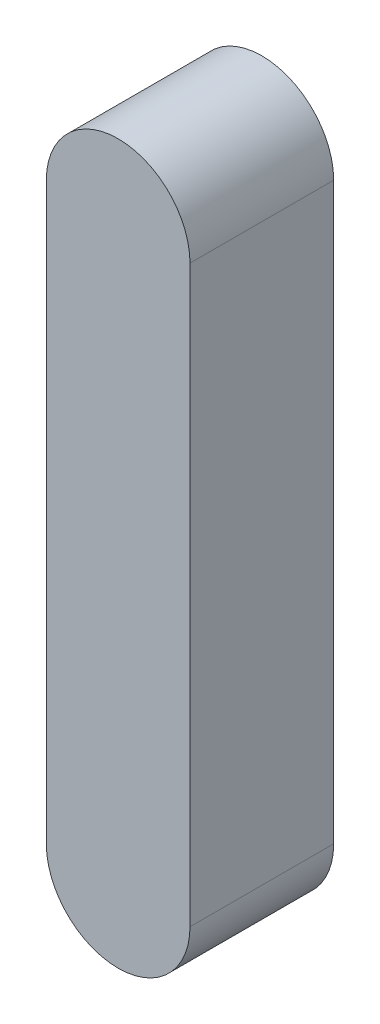
ISO-10303-21;
HEADER;
FILE_DESCRIPTION(('STEP AP214'),'2;1');
FILE_NAME('part.step','',(''),(''),'','','');
FILE_SCHEMA(('AUTOMOTIVE_DESIGN { 1 0 10303 214 1 1 1 1 }'));
ENDSEC;
DATA;
#1=APPLICATION_CONTEXT('core data for automotive mechanical design processes');
#2=APPLICATION_PROTOCOL_DEFINITION('international standard','automotive_design',2000,#1);
#3=PRODUCT_CONTEXT('',#1,'mechanical');
#4=PRODUCT('Part','Part','',(#3));
#5=PRODUCT_RELATED_PRODUCT_CATEGORY('part','',(#4));
#6=PRODUCT_DEFINITION_FORMATION('','',#4);
#7=PRODUCT_DEFINITION_CONTEXT('part definition',#1,'design');
#8=PRODUCT_DEFINITION('design','',#6,#7);
#9=PRODUCT_DEFINITION_SHAPE('','',#8);
#10=(LENGTH_UNIT() NAMED_UNIT(*) SI_UNIT(.MILLI.,.METRE.));
#11=(NAMED_UNIT(*) PLANE_ANGLE_UNIT() SI_UNIT($,.RADIAN.));
#12=(NAMED_UNIT(*) SI_UNIT($,.STERADIAN.) SOLID_ANGLE_UNIT());
#13=UNCERTAINTY_MEASURE_WITH_UNIT(LENGTH_MEASURE(1.E-05),#10,'distance_accuracy_value','');
#14=(GEOMETRIC_REPRESENTATION_CONTEXT(3) GLOBAL_UNCERTAINTY_ASSIGNED_CONTEXT((#13)) GLOBAL_UNIT_ASSIGNED_CONTEXT((#10,
#11,#12)) REPRESENTATION_CONTEXT('',''));
#15=CARTESIAN_POINT('',(0.,0.,0.));
#16=DIRECTION('',(0.,0.,1.));
#17=DIRECTION('',(1.,0.,0.));
#18=AXIS2_PLACEMENT_3D('',#15,#16,#17);
#19=CARTESIAN_POINT('',(0.,-4.,2.));
#20=DIRECTION('',(0.,0.,-1.));
#21=DIRECTION('',(-1.,0.,0.));
#22=AXIS2_PLACEMENT_3D('',#19,#20,#21);
#23=CYLINDRICAL_SURFACE('',#22,1.);
#24=CARTESIAN_POINT('',(0.,-4.,0.));
#25=DIRECTION('',(0.,0.,1.));
#26=DIRECTION('',(1.,0.,0.));
#27=AXIS2_PLACEMENT_3D('',#24,#25,#26);
#28=CIRCLE('',#27,1.);
#29=CARTESIAN_POINT('',(-0.999999999999999,-4.,0.));
#30=VERTEX_POINT('',#29);
#31=CARTESIAN_POINT('',(1.,-4.,0.));
#32=VERTEX_POINT('',#31);
#33=EDGE_CURVE('E100',#30,#32,#28,.T.);
#34=ORIENTED_EDGE('',*,*,#33,.T.);
#35=DIRECTION('',(0.,0.,-1.));
#36=VECTOR('',#35,1.);
#37=CARTESIAN_POINT('',(1.,-4.,2.));
#38=LINE('',#37,#36);
#39=CARTESIAN_POINT('',(1.,-4.,2.));
#40=VERTEX_POINT('',#39);
#41=EDGE_CURVE('E11',#40,#32,#38,.T.);
#42=ORIENTED_EDGE('',*,*,#41,.F.);
#43=CARTESIAN_POINT('',(0.,-4.,2.));
#44=DIRECTION('',(0.,0.,1.));
#45=DIRECTION('',(1.,0.,0.));
#46=AXIS2_PLACEMENT_3D('',#43,#44,#45);
#47=CIRCLE('',#46,1.);
#48=CARTESIAN_POINT('',(-0.999999999999999,-4.,2.));
#49=VERTEX_POINT('',#48);
#50=EDGE_CURVE('E88',#49,#40,#47,.T.);
#51=ORIENTED_EDGE('',*,*,#50,.F.);
#52=DIRECTION('',(0.,0.,-1.));
#53=VECTOR('',#52,1.);
#54=CARTESIAN_POINT('',(-0.999999999999999,-4.,2.));
#55=LINE('',#54,#53);
#56=EDGE_CURVE('E96',#49,#30,#55,.T.);
#57=ORIENTED_EDGE('',*,*,#56,.T.);
#58=EDGE_LOOP('',(#34,#42,#51,#57));
#59=FACE_BOUND('',#58,.T.);
#60=ADVANCED_FACE('F37',(#59),#23,.T.);
#61=CARTESIAN_POINT('',(1.,4.,2.));
#62=DIRECTION('',(-1.,0.,0.));
#63=DIRECTION('',(0.,-1.,0.));
#64=AXIS2_PLACEMENT_3D('',#61,#62,#63);
#65=PLANE('',#64);
#66=DIRECTION('',(0.,1.,0.));
#67=VECTOR('',#66,1.);
#68=CARTESIAN_POINT('',(1.,4.,0.));
#69=LINE('',#68,#67);
#70=CARTESIAN_POINT('',(1.,4.,0.));
#71=VERTEX_POINT('',#70);
#72=EDGE_CURVE('E92',#32,#71,#69,.T.);
#73=ORIENTED_EDGE('',*,*,#72,.T.);
#74=DIRECTION('',(0.,0.,-1.));
#75=VECTOR('',#74,1.);
#76=CARTESIAN_POINT('',(1.,4.,2.));
#77=LINE('',#76,#75);
#78=CARTESIAN_POINT('',(1.,4.,2.));
#79=VERTEX_POINT('',#78);
#80=EDGE_CURVE('E45',#79,#71,#77,.T.);
#81=ORIENTED_EDGE('',*,*,#80,.F.);
#82=DIRECTION('',(0.,1.,0.));
#83=VECTOR('',#82,1.);
#84=CARTESIAN_POINT('',(1.,4.,2.));
#85=LINE('',#84,#83);
#86=EDGE_CURVE('E83',#40,#79,#85,.T.);
#87=ORIENTED_EDGE('',*,*,#86,.F.);
#88=ORIENTED_EDGE('',*,*,#41,.T.);
#89=EDGE_LOOP('',(#73,#81,#87,#88));
#90=FACE_BOUND('',#89,.T.);
#91=ADVANCED_FACE('F91',(#90),#65,.F.);
#92=CARTESIAN_POINT('',(0.,4.,2.));
#93=DIRECTION('',(0.,0.,-1.));
#94=DIRECTION('',(-1.,0.,0.));
#95=AXIS2_PLACEMENT_3D('',#92,#93,#94);
#96=CYLINDRICAL_SURFACE('',#95,1.);
#97=CARTESIAN_POINT('',(0.,4.,0.));
#98=DIRECTION('',(0.,0.,1.));
#99=DIRECTION('',(1.,0.,0.));
#100=AXIS2_PLACEMENT_3D('',#97,#98,#99);
#101=CIRCLE('',#100,1.);
#102=CARTESIAN_POINT('',(-1.,4.,0.));
#103=VERTEX_POINT('',#102);
#104=EDGE_CURVE('E70',#71,#103,#101,.T.);
#105=ORIENTED_EDGE('',*,*,#104,.T.);
#106=DIRECTION('',(0.,0.,-1.));
#107=VECTOR('',#106,1.);
#108=CARTESIAN_POINT('',(-1.,4.,2.));
#109=LINE('',#108,#107);
#110=CARTESIAN_POINT('',(-1.,4.,2.));
#111=VERTEX_POINT('',#110);
#112=EDGE_CURVE('E93',#111,#103,#109,.T.);
#113=ORIENTED_EDGE('',*,*,#112,.F.);
#114=CARTESIAN_POINT('',(0.,4.,2.));
#115=DIRECTION('',(0.,0.,1.));
#116=DIRECTION('',(1.,0.,0.));
#117=AXIS2_PLACEMENT_3D('',#114,#115,#116);
#118=CIRCLE('',#117,1.);
#119=EDGE_CURVE('E86',#79,#111,#118,.T.);
#120=ORIENTED_EDGE('',*,*,#119,.F.);
#121=ORIENTED_EDGE('',*,*,#80,.T.);
#122=EDGE_LOOP('',(#105,#113,#120,#121));
#123=FACE_BOUND('',#122,.T.);
#124=ADVANCED_FACE('F94',(#123),#96,.T.);
#125=CARTESIAN_POINT('',(-1.,4.,2.));
#126=DIRECTION('',(1.,0.,0.));
#127=DIRECTION('',(0.,1.,0.));
#128=AXIS2_PLACEMENT_3D('',#125,#126,#127);
#129=PLANE('',#128);
#130=DIRECTION('',(0.,-1.,0.));
#131=VECTOR('',#130,1.);
#132=CARTESIAN_POINT('',(-1.,4.,0.));
#133=LINE('',#132,#131);
#134=EDGE_CURVE('E76',#103,#30,#133,.T.);
#135=ORIENTED_EDGE('',*,*,#134,.T.);
#136=ORIENTED_EDGE('',*,*,#56,.F.);
#137=DIRECTION('',(0.,-1.,0.));
#138=VECTOR('',#137,1.);
#139=CARTESIAN_POINT('',(-1.,4.,2.));
#140=LINE('',#139,#138);
#141=EDGE_CURVE('E53',#111,#49,#140,.T.);
#142=ORIENTED_EDGE('',*,*,#141,.F.);
#143=ORIENTED_EDGE('',*,*,#112,.T.);
#144=EDGE_LOOP('',(#135,#136,#142,#143));
#145=FACE_BOUND('',#144,.T.);
#146=ADVANCED_FACE('F107',(#145),#129,.F.);
#147=CARTESIAN_POINT('',(0.,-4.,2.));
#148=DIRECTION('',(0.,0.,1.));
#149=DIRECTION('',(1.,0.,0.));
#150=AXIS2_PLACEMENT_3D('',#147,#148,#149);
#151=PLANE('',#150);
#152=ORIENTED_EDGE('',*,*,#50,.T.);
#153=ORIENTED_EDGE('',*,*,#86,.T.);
#154=ORIENTED_EDGE('',*,*,#119,.T.);
#155=ORIENTED_EDGE('',*,*,#141,.T.);
#156=EDGE_LOOP('',(#152,#153,#154,#155));
#157=FACE_BOUND('',#156,.T.);
#158=ADVANCED_FACE('F84',(#157),#151,.T.);
#159=CARTESIAN_POINT('',(0.,-4.,0.));
#160=DIRECTION('',(0.,0.,1.));
#161=DIRECTION('',(1.,0.,0.));
#162=AXIS2_PLACEMENT_3D('',#159,#160,#161);
#163=PLANE('',#162);
#164=ORIENTED_EDGE('',*,*,#33,.F.);
#165=ORIENTED_EDGE('',*,*,#134,.F.);
#166=ORIENTED_EDGE('',*,*,#104,.F.);
#167=ORIENTED_EDGE('',*,*,#72,.F.);
#168=EDGE_LOOP('',(#164,#165,#166,#167));
#169=FACE_BOUND('',#168,.T.);
#170=ADVANCED_FACE('F110',(#169),#163,.F.);
#171=CLOSED_SHELL('',(#60,#91,#124,#146,#158,#170));
#172=MANIFOLD_SOLID_BREP('B2',#171);
#173=ADVANCED_BREP_SHAPE_REPRESENTATION('',(#18,#172),#14);
#174=SHAPE_DEFINITION_REPRESENTATION(#9,#173);
ENDSEC;
END-ISO-10303-21;
